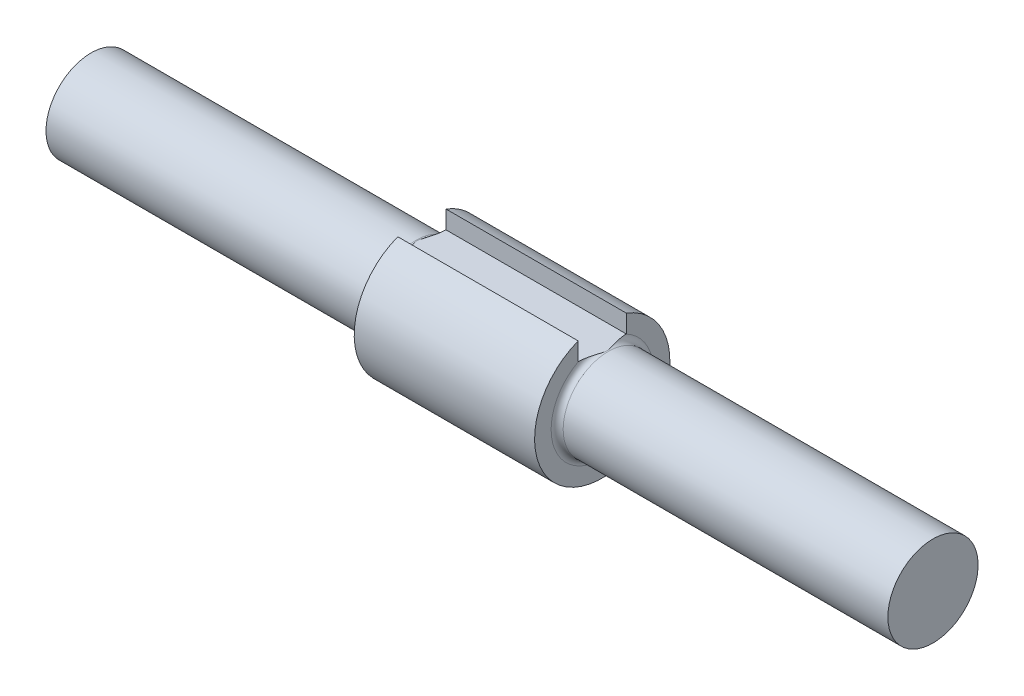
ISO-10303-21;
HEADER;
FILE_DESCRIPTION(('STEP AP214'),'2;1');
FILE_NAME('part.step','',(''),(''),'','','');
FILE_SCHEMA(('AUTOMOTIVE_DESIGN { 1 0 10303 214 1 1 1 1 }'));
ENDSEC;
DATA;
#1=APPLICATION_CONTEXT('core data for automotive mechanical design processes');
#2=APPLICATION_PROTOCOL_DEFINITION('international standard','automotive_design',2000,#1);
#3=PRODUCT_CONTEXT('',#1,'mechanical');
#4=PRODUCT('Part','Part','',(#3));
#5=PRODUCT_RELATED_PRODUCT_CATEGORY('part','',(#4));
#6=PRODUCT_DEFINITION_FORMATION('','',#4);
#7=PRODUCT_DEFINITION_CONTEXT('part definition',#1,'design');
#8=PRODUCT_DEFINITION('design','',#6,#7);
#9=PRODUCT_DEFINITION_SHAPE('','',#8);
#10=(LENGTH_UNIT() NAMED_UNIT(*) SI_UNIT(.MILLI.,.METRE.));
#11=(NAMED_UNIT(*) PLANE_ANGLE_UNIT() SI_UNIT($,.RADIAN.));
#12=(NAMED_UNIT(*) SI_UNIT($,.STERADIAN.) SOLID_ANGLE_UNIT());
#13=UNCERTAINTY_MEASURE_WITH_UNIT(LENGTH_MEASURE(1.E-05),#10,'distance_accuracy_value','');
#14=(GEOMETRIC_REPRESENTATION_CONTEXT(3) GLOBAL_UNCERTAINTY_ASSIGNED_CONTEXT((#13)) GLOBAL_UNIT_ASSIGNED_CONTEXT((#10,
#11,#12)) REPRESENTATION_CONTEXT('',''));
#15=CARTESIAN_POINT('',(0.,0.,0.));
#16=DIRECTION('',(0.,0.,1.));
#17=DIRECTION('',(1.,0.,0.));
#18=AXIS2_PLACEMENT_3D('',#15,#16,#17);
#19=CARTESIAN_POINT('',(16.,0.,0.));
#20=DIRECTION('',(-1.,0.,0.));
#21=DIRECTION('',(0.,0.,1.));
#22=AXIS2_PLACEMENT_3D('',#19,#20,#21);
#23=TOROIDAL_SURFACE('',#22,8.5,1.);
#24=CARTESIAN_POINT('',(16.,0.,0.));
#25=DIRECTION('',(-1.,0.,0.));
#26=DIRECTION('',(0.,0.,1.));
#27=AXIS2_PLACEMENT_3D('',#24,#25,#26);
#28=CIRCLE('',#27,7.5);
#29=CARTESIAN_POINT('',(16.,0.,7.5));
#30=VERTEX_POINT('',#29);
#31=EDGE_CURVE('E45',#30,#30,#28,.F.);
#32=ORIENTED_EDGE('',*,*,#31,.F.);
#33=EDGE_LOOP('',(#32));
#34=FACE_BOUND('',#33,.T.);
#35=CARTESIAN_POINT('',(15.,7.51487042240655,3.97199226263587));
#36=CARTESIAN_POINT('',(15.0000187505589,7.51487042240655,3.88703352085631));
#37=CARTESIAN_POINT('',(15.0023630392669,7.51487042240655,3.80210585867956));
#38=CARTESIAN_POINT('',(15.011135742183,7.51487042240655,3.63251024263131));
#39=CARTESIAN_POINT('',(15.0175616146759,7.51487042240655,3.54784216006022));
#40=CARTESIAN_POINT('',(15.0339098908058,7.51487042240655,3.3790850231573));
#41=CARTESIAN_POINT('',(15.0438228190897,7.51487042240655,3.29499502309886));
#42=CARTESIAN_POINT('',(15.0666981329807,7.51487042240655,3.12722160038694));
#43=CARTESIAN_POINT('',(15.0796610412921,7.51487042240655,3.04353824993677));
#44=CARTESIAN_POINT('',(15.1218302997458,7.51487042240655,2.79714902328586));
#45=CARTESIAN_POINT('',(15.1547498950543,7.51487042240655,2.6350769640333));
#46=CARTESIAN_POINT('',(15.2281368403217,7.51487042240655,2.31258774451004));
#47=CARTESIAN_POINT('',(15.2686093003015,7.51487042240655,2.15217178270574));
#48=CARTESIAN_POINT('',(15.3422899468921,7.51487042240655,1.87943471257915));
#49=CARTESIAN_POINT('',(15.3741681430943,7.51487042240655,1.76674848910801));
#50=CARTESIAN_POINT('',(15.4397974027,7.51487042240655,1.54192313128326));
#51=CARTESIAN_POINT('',(15.473548517696,7.51487042240655,1.42978401209319));
#52=CARTESIAN_POINT('',(15.5423173621176,7.51487042240655,1.204694155472));
#53=CARTESIAN_POINT('',(15.5773442730905,7.51487042240655,1.09174625740689));
#54=CARTESIAN_POINT('',(15.6293581804725,7.51487042240655,0.922166560801882));
#55=CARTESIAN_POINT('',(15.6466077465711,7.51487042240655,0.865615886836521));
#56=CARTESIAN_POINT('',(15.6805476971529,7.51487042240655,0.752347752002099));
#57=CARTESIAN_POINT('',(15.6972381026146,7.51487042240655,0.695630297477327));
#58=CARTESIAN_POINT('',(15.7292061090391,7.51487042240655,0.582697232278781));
#59=CARTESIAN_POINT('',(15.7445009381991,7.51487042240655,0.526486585173341));
#60=CARTESIAN_POINT('',(15.7728828178778,7.51487042240655,0.413444393899795));
#61=CARTESIAN_POINT('',(15.7859680756157,7.51487042240655,0.356612385003505));
#62=CARTESIAN_POINT('',(15.8077873021507,7.51487042240655,0.242909804561486));
#63=CARTESIAN_POINT('',(15.816581748859,7.51487042240655,0.186051798674885));
#64=CARTESIAN_POINT('',(15.8273423669651,7.51487042240655,0.0718132339081105));
#65=CARTESIAN_POINT('',(15.8293330652533,7.51487042240655,0.0144353012410257));
#66=CARTESIAN_POINT('',(15.8257171812296,7.51487042240655,-0.0978298791481195));
#67=CARTESIAN_POINT('',(15.8204005872786,7.51487042240655,-0.15272785469215));
#68=CARTESIAN_POINT('',(15.8046725197431,7.51487042240655,-0.261823380321094));
#69=CARTESIAN_POINT('',(15.7942507215727,7.51487042240655,-0.316019281605397));
#70=CARTESIAN_POINT('',(15.7703926152009,7.51487042240655,-0.424221460912556));
#71=CARTESIAN_POINT('',(15.756930087757,7.51487042240655,-0.478221670115047));
#72=CARTESIAN_POINT('',(15.7284085960532,7.51487042240655,-0.585743568581094));
#73=CARTESIAN_POINT('',(15.7133508839795,7.51487042240655,-0.639265597937844));
#74=CARTESIAN_POINT('',(15.665822416007,7.51487042240655,-0.803476931157981));
#75=CARTESIAN_POINT('',(15.6320316545254,7.51487042240655,-0.913777602019959));
#76=CARTESIAN_POINT('',(15.5643102641447,7.51487042240655,-1.13376370455158));
#77=CARTESIAN_POINT('',(15.530381022138,7.51487042240655,-1.24344960678863));
#78=CARTESIAN_POINT('',(15.4642842883255,7.51487042240655,-1.46053930114408));
#79=CARTESIAN_POINT('',(15.4320941247495,7.51487042240655,-1.5679360084842));
#80=CARTESIAN_POINT('',(15.3694883043932,7.51487042240655,-1.78323916318933));
#81=CARTESIAN_POINT('',(15.3390726257398,7.51487042240655,-1.8911456042534));
#82=CARTESIAN_POINT('',(15.2513808092698,7.51487042240655,-2.21636312315868));
#83=CARTESIAN_POINT('',(15.1978017647467,7.51487042240655,-2.43472778164977));
#84=CARTESIAN_POINT('',(15.1295797977089,7.51487042240655,-2.76244784518246));
#85=CARTESIAN_POINT('',(15.1090197799795,7.51487042240655,-2.87056936639991));
#86=CARTESIAN_POINT('',(15.072416964731,7.51487042240655,-3.08756671579516));
#87=CARTESIAN_POINT('',(15.0563733642104,7.51487042240655,-3.19644240635308));
#88=CARTESIAN_POINT('',(15.0297246661582,7.51487042240655,-3.41467690514383));
#89=CARTESIAN_POINT('',(15.0191097686074,7.51487042240655,-3.5240344807964));
#90=CARTESIAN_POINT('',(15.0043652125565,7.51487042240655,-3.7431660807675));
#91=CARTESIAN_POINT('',(15.0002339927254,7.51487042240655,-3.85293999844233));
#92=CARTESIAN_POINT('',(14.9997315589716,7.51487042240655,-4.09849629509067));
#93=CARTESIAN_POINT('',(15.0054196238268,7.51487042240655,-4.23430847815995));
#94=CARTESIAN_POINT('',(15.025499847861,7.51487042240655,-4.43759393184489));
#95=CARTESIAN_POINT('',(15.0341931435305,7.51487042240655,-4.50563317249623));
#96=CARTESIAN_POINT('',(15.0561070883657,7.51487042240655,-4.64105848337031));
#97=CARTESIAN_POINT('',(15.0693333837213,7.51487042240655,-4.70844363071249));
#98=CARTESIAN_POINT('',(15.0851268071502,7.51487042240655,-4.7752834212117));
#99=B_SPLINE_CURVE_WITH_KNOTS('',3,(#35,#36,#37,#38,#39,#40,#41,#42,#43,#44,#45,#46,#47,#48,#49,
#50,#51,#52,#53,#54,#55,#56,#57,#58,#59,#60,#61,#62,#63,#64,#65,#66,#67,#68,#69,#70,#71,#72,#73,
#74,#75,#76,#77,#78,#79,#80,#81,#82,#83,#84,#85,#86,#87,#88,#89,#90,#91,#92,#93,#94,#95,#96,#97,
#98),.UNSPECIFIED.,.F.,.F.,(4,2,2,2,2,2,2,2,2,2,2,2,2,2,2,2,2,2,2,2,2,2,2,2,2,2,2,2,2,2,2,4),
(0.,0.254800041369204,0.509441567052595,0.763396435016173,1.01739485740921,1.51326524793099,
2.0094723524663,2.36077745366209,2.71209223695072,3.06685582290921,3.24422383642343,
3.42158518800213,3.59632650066852,3.77120891902509,3.94354958000482,4.11526830961506,
4.2803656310432,4.4457982266006,4.61271578432215,4.77950327275994,5.12556443232155,
5.47001193991619,5.80634813915575,6.14268019168296,6.81674371821175,7.14684554040642,
7.47688863465423,7.80633380562715,8.13569963089529,8.54272200563269,8.74836431850698,
8.95426371080245),.UNSPECIFIED.);
#100=CARTESIAN_POINT('',(15.,7.51487042240655,3.97199226263587));
#101=VERTEX_POINT('',#100);
#102=CARTESIAN_POINT('',(15.,7.51487042240655,-3.97199226263587));
#103=VERTEX_POINT('',#102);
#104=EDGE_CURVE('E11',#101,#103,#99,.T.);
#105=ORIENTED_EDGE('',*,*,#104,.F.);
#106=CARTESIAN_POINT('',(15.,0.,0.));
#107=DIRECTION('',(-1.,0.,0.));
#108=DIRECTION('',(0.,0.,1.));
#109=AXIS2_PLACEMENT_3D('',#106,#107,#108);
#110=CIRCLE('',#109,8.5);
#111=EDGE_CURVE('E108',#103,#101,#110,.T.);
#112=ORIENTED_EDGE('',*,*,#111,.F.);
#113=EDGE_LOOP('',(#105,#112));
#114=FACE_BOUND('',#113,.T.);
#115=ADVANCED_FACE('F33',(#34,#114),#23,.F.);
#116=CARTESIAN_POINT('',(-16.,0.,0.));
#117=DIRECTION('',(1.,0.,0.));
#118=DIRECTION('',(0.,0.,-1.));
#119=AXIS2_PLACEMENT_3D('',#116,#117,#118);
#120=TOROIDAL_SURFACE('',#119,8.5,1.);
#121=CARTESIAN_POINT('',(-16.,0.,0.));
#122=DIRECTION('',(1.,0.,0.));
#123=DIRECTION('',(0.,0.,-1.));
#124=AXIS2_PLACEMENT_3D('',#121,#122,#123);
#125=CIRCLE('',#124,7.5);
#126=CARTESIAN_POINT('',(-16.,0.,-7.5));
#127=VERTEX_POINT('',#126);
#128=EDGE_CURVE('E135',#127,#127,#125,.F.);
#129=ORIENTED_EDGE('',*,*,#128,.F.);
#130=EDGE_LOOP('',(#129));
#131=FACE_BOUND('',#130,.T.);
#132=CARTESIAN_POINT('',(-15.,7.51487042240655,-3.97199226263588));
#133=CARTESIAN_POINT('',(-15.0000187505589,7.51487042240655,-3.88703352085633));
#134=CARTESIAN_POINT('',(-15.0023630392669,7.51487042240655,-3.80210585867958));
#135=CARTESIAN_POINT('',(-15.011135742183,7.51487042240655,-3.63251024263133));
#136=CARTESIAN_POINT('',(-15.0175616146759,7.51487042240655,-3.54784216006024));
#137=CARTESIAN_POINT('',(-15.0339098908058,7.51487042240655,-3.37908502315732));
#138=CARTESIAN_POINT('',(-15.0438228190897,7.51487042240655,-3.29499502309888));
#139=CARTESIAN_POINT('',(-15.0666981329807,7.51487042240655,-3.12722160038696));
#140=CARTESIAN_POINT('',(-15.0796610412921,7.51487042240655,-3.0435382499368));
#141=CARTESIAN_POINT('',(-15.1218302997458,7.51487042240655,-2.79714902328589));
#142=CARTESIAN_POINT('',(-15.1547498950543,7.51487042240655,-2.63507696403333));
#143=CARTESIAN_POINT('',(-15.2281368403217,7.51487042240655,-2.31258774451007));
#144=CARTESIAN_POINT('',(-15.2686093003015,7.51487042240655,-2.15217178270577));
#145=CARTESIAN_POINT('',(-15.3422899468921,7.51487042240655,-1.87943471257918));
#146=CARTESIAN_POINT('',(-15.3741681430943,7.51487042240655,-1.76674848910805));
#147=CARTESIAN_POINT('',(-15.4397974027,7.51487042240655,-1.5419231312833));
#148=CARTESIAN_POINT('',(-15.473548517696,7.51487042240655,-1.42978401209324));
#149=CARTESIAN_POINT('',(-15.5423173621176,7.51487042240655,-1.20469415547205));
#150=CARTESIAN_POINT('',(-15.5773442730905,7.51487042240655,-1.09174625740695));
#151=CARTESIAN_POINT('',(-15.6293581804725,7.51487042240655,-0.922166560801942));
#152=CARTESIAN_POINT('',(-15.6466077465711,7.51487042240655,-0.865615886836582));
#153=CARTESIAN_POINT('',(-15.6805476971529,7.51487042240655,-0.752347752002163));
#154=CARTESIAN_POINT('',(-15.6972381026146,7.51487042240655,-0.695630297477392));
#155=CARTESIAN_POINT('',(-15.7292061090391,7.51487042240655,-0.582697232278841));
#156=CARTESIAN_POINT('',(-15.7445009381991,7.51487042240655,-0.526486585173395));
#157=CARTESIAN_POINT('',(-15.7728828178778,7.51487042240655,-0.413444393899838));
#158=CARTESIAN_POINT('',(-15.7859680756157,7.51487042240655,-0.356612385003541));
#159=CARTESIAN_POINT('',(-15.8077873021507,7.51487042240655,-0.24290980456151));
#160=CARTESIAN_POINT('',(-15.816581748859,7.51487042240655,-0.186051798674904));
#161=CARTESIAN_POINT('',(-15.8273423669651,7.51487042240655,-0.0718132339081161));
#162=CARTESIAN_POINT('',(-15.8293330652533,7.51487042240655,-0.0144353012410245));
#163=CARTESIAN_POINT('',(-15.8257171812297,7.51487042240655,0.097829879148136));
#164=CARTESIAN_POINT('',(-15.8204005872787,7.51487042240655,0.152727854692175));
#165=CARTESIAN_POINT('',(-15.8046725197431,7.51487042240655,0.261823380321136));
#166=CARTESIAN_POINT('',(-15.7942507215728,7.51487042240655,0.316019281605447));
#167=CARTESIAN_POINT('',(-15.7703926152009,7.51487042240655,0.424221460912623));
#168=CARTESIAN_POINT('',(-15.756930087757,7.51487042240655,0.478221670115123));
#169=CARTESIAN_POINT('',(-15.7284085960532,7.51487042240655,0.585743568581186));
#170=CARTESIAN_POINT('',(-15.7133508839795,7.51487042240655,0.639265597937945));
#171=CARTESIAN_POINT('',(-15.665822416007,7.51487042240655,0.803476931158111));
#172=CARTESIAN_POINT('',(-15.6320316545254,7.51487042240655,0.913777602020109));
#173=CARTESIAN_POINT('',(-15.5643102641447,7.51487042240655,1.13376370455177));
#174=CARTESIAN_POINT('',(-15.530381022138,7.51487042240655,1.24344960678884));
#175=CARTESIAN_POINT('',(-15.4642842883255,7.51487042240655,1.46053930114433));
#176=CARTESIAN_POINT('',(-15.4320941247494,7.51487042240655,1.56793600848447));
#177=CARTESIAN_POINT('',(-15.3694883043931,7.51487042240655,1.78323916318965));
#178=CARTESIAN_POINT('',(-15.3390726257398,7.51487042240655,1.89114560425374));
#179=CARTESIAN_POINT('',(-15.2513808092697,7.51487042240655,2.21636312315908));
#180=CARTESIAN_POINT('',(-15.1978017647466,7.51487042240655,2.43472778165022));
#181=CARTESIAN_POINT('',(-15.1295797977088,7.51487042240655,2.76244784518297));
#182=CARTESIAN_POINT('',(-15.1090197799794,7.51487042240655,2.87056936640044));
#183=CARTESIAN_POINT('',(-15.0724169647309,7.51487042240655,3.08756671579573));
#184=CARTESIAN_POINT('',(-15.0563733642104,7.51487042240655,3.19644240635367));
#185=CARTESIAN_POINT('',(-15.0297246661581,7.51487042240655,3.41467690514446));
#186=CARTESIAN_POINT('',(-15.0191097686073,7.51487042240655,3.52403448079706));
#187=CARTESIAN_POINT('',(-15.0043652125565,7.51487042240655,3.74316608076819));
#188=CARTESIAN_POINT('',(-15.0002339927254,7.51487042240655,3.85293999844304));
#189=CARTESIAN_POINT('',(-14.9997315589716,7.51487042240655,4.09849629509136));
#190=CARTESIAN_POINT('',(-15.0054196238268,7.51487042240655,4.2343084781606));
#191=CARTESIAN_POINT('',(-15.025499847861,7.51487042240655,4.43759393184547));
#192=CARTESIAN_POINT('',(-15.0341931435305,7.51487042240655,4.50563317249678));
#193=CARTESIAN_POINT('',(-15.0561070883658,7.51487042240655,4.64105848337082));
#194=CARTESIAN_POINT('',(-15.0693333837214,7.51487042240655,4.70844363071298));
#195=CARTESIAN_POINT('',(-15.0851268071503,7.51487042240655,4.77528342121215));
#196=B_SPLINE_CURVE_WITH_KNOTS('',3,(#132,#133,#134,#135,#136,#137,#138,#139,#140,#141,#142,
#143,#144,#145,#146,#147,#148,#149,#150,#151,#152,#153,#154,#155,#156,#157,#158,#159,#160,#161,
#162,#163,#164,#165,#166,#167,#168,#169,#170,#171,#172,#173,#174,#175,#176,#177,#178,#179,#180,
#181,#182,#183,#184,#185,#186,#187,#188,#189,#190,#191,#192,#193,#194,#195),.UNSPECIFIED.,.F.,
.F.,(4,2,2,2,2,2,2,2,2,2,2,2,2,2,2,2,2,2,2,2,2,2,2,2,2,2,2,2,2,2,2,4),(0.,0.254800041369202,
0.509441567052591,0.763396435016167,1.0173948574092,1.51326524793097,2.00947235246629,
2.36077745366206,2.71209223695069,3.06685582290917,3.24422383642338,3.42158518800209,
3.59632650066849,3.77120891902508,3.94354958000483,4.1152683096151,4.28036563104326,
4.44579822660068,4.61271578432226,4.77950327276008,5.12556443232176,5.47001193991647,
5.80634813915609,6.14268019168336,6.81674371821228,7.14684554040701,7.47688863465488,
7.80633380562786,8.13569963089606,8.54272200563333,8.74836431850755,8.95426371080295),.UNSPECIFIED.);
#197=CARTESIAN_POINT('',(-15.,7.51487042240655,-3.97199226263588));
#198=VERTEX_POINT('',#197);
#199=CARTESIAN_POINT('',(-15.,7.51487042240655,3.97199226263588));
#200=VERTEX_POINT('',#199);
#201=EDGE_CURVE('E138',#198,#200,#196,.T.);
#202=ORIENTED_EDGE('',*,*,#201,.F.);
#203=CARTESIAN_POINT('',(-15.,0.,0.));
#204=DIRECTION('',(1.,0.,0.));
#205=DIRECTION('',(0.,0.,-1.));
#206=AXIS2_PLACEMENT_3D('',#203,#204,#205);
#207=CIRCLE('',#206,8.5);
#208=EDGE_CURVE('E132',#200,#198,#207,.T.);
#209=ORIENTED_EDGE('',*,*,#208,.F.);
#210=EDGE_LOOP('',(#202,#209));
#211=FACE_BOUND('',#210,.T.);
#212=ADVANCED_FACE('F143',(#131,#211),#120,.F.);
#213=CARTESIAN_POINT('',(15.,7.49999999999999,0.));
#214=DIRECTION('',(-1.,0.,0.));
#215=DIRECTION('',(0.,0.,1.));
#216=AXIS2_PLACEMENT_3D('',#213,#214,#215);
#217=PLANE('',#216);
#218=DIRECTION('',(0.,0.,-1.));
#219=VECTOR('',#218,1.);
#220=CARTESIAN_POINT('',(15.,7.51487042240655,0.));
#221=LINE('',#220,#219);
#222=CARTESIAN_POINT('',(15.,7.51487042240655,-4.));
#223=VERTEX_POINT('',#222);
#224=EDGE_CURVE('E97',#103,#223,#221,.T.);
#225=ORIENTED_EDGE('',*,*,#224,.F.);
#226=ORIENTED_EDGE('',*,*,#111,.T.);
#227=CARTESIAN_POINT('',(15.,7.51487042240655,4.));
#228=VERTEX_POINT('',#227);
#229=EDGE_CURVE('E101',#228,#101,#221,.T.);
#230=ORIENTED_EDGE('',*,*,#229,.F.);
#231=DIRECTION('',(0.,-1.,0.));
#232=VECTOR('',#231,1.);
#233=CARTESIAN_POINT('',(15.,7.49999999999999,4.));
#234=LINE('',#233,#232);
#235=CARTESIAN_POINT('',(15.,10.5148704224065,4.));
#236=VERTEX_POINT('',#235);
#237=EDGE_CURVE('E86',#236,#228,#234,.T.);
#238=ORIENTED_EDGE('',*,*,#237,.F.);
#239=CARTESIAN_POINT('',(15.,0.,0.));
#240=DIRECTION('',(-1.,0.,0.));
#241=DIRECTION('',(0.,0.,1.));
#242=AXIS2_PLACEMENT_3D('',#239,#240,#241);
#243=CIRCLE('',#242,11.25);
#244=CARTESIAN_POINT('',(15.,10.5148704224065,-4.));
#245=VERTEX_POINT('',#244);
#246=EDGE_CURVE('E120',#245,#236,#243,.T.);
#247=ORIENTED_EDGE('',*,*,#246,.F.);
#248=DIRECTION('',(0.,1.,0.));
#249=VECTOR('',#248,1.);
#250=CARTESIAN_POINT('',(15.,7.49999999999999,-4.));
#251=LINE('',#250,#249);
#252=EDGE_CURVE('E109',#223,#245,#251,.T.);
#253=ORIENTED_EDGE('',*,*,#252,.F.);
#254=EDGE_LOOP('',(#225,#226,#230,#238,#247,#253));
#255=FACE_BOUND('',#254,.T.);
#256=ADVANCED_FACE('F107',(#255),#217,.F.);
#257=CARTESIAN_POINT('',(0.,0.,0.));
#258=DIRECTION('',(-1.,0.,0.));
#259=DIRECTION('',(0.,0.,1.));
#260=AXIS2_PLACEMENT_3D('',#257,#258,#259);
#261=CYLINDRICAL_SURFACE('',#260,11.25);
#262=DIRECTION('',(1.,0.,0.));
#263=VECTOR('',#262,1.);
#264=CARTESIAN_POINT('',(-70.,10.5148704224065,-4.));
#265=LINE('',#264,#263);
#266=CARTESIAN_POINT('',(-15.,10.5148704224065,-4.));
#267=VERTEX_POINT('',#266);
#268=EDGE_CURVE('E98',#267,#245,#265,.T.);
#269=ORIENTED_EDGE('',*,*,#268,.T.);
#270=ORIENTED_EDGE('',*,*,#246,.T.);
#271=DIRECTION('',(1.,0.,0.));
#272=VECTOR('',#271,1.);
#273=CARTESIAN_POINT('',(-70.,10.5148704224065,4.));
#274=LINE('',#273,#272);
#275=CARTESIAN_POINT('',(-15.,10.5148704224065,4.));
#276=VERTEX_POINT('',#275);
#277=EDGE_CURVE('E92',#276,#236,#274,.T.);
#278=ORIENTED_EDGE('',*,*,#277,.F.);
#279=CARTESIAN_POINT('',(-15.,0.,0.));
#280=DIRECTION('',(-1.,0.,0.));
#281=DIRECTION('',(0.,0.,1.));
#282=AXIS2_PLACEMENT_3D('',#279,#280,#281);
#283=CIRCLE('',#282,11.25);
#284=EDGE_CURVE('E117',#267,#276,#283,.T.);
#285=ORIENTED_EDGE('',*,*,#284,.F.);
#286=EDGE_LOOP('',(#269,#270,#278,#285));
#287=FACE_BOUND('',#286,.T.);
#288=ADVANCED_FACE('F163',(#287),#261,.T.);
#289=CARTESIAN_POINT('',(-15.,11.25,0.));
#290=DIRECTION('',(1.,0.,0.));
#291=DIRECTION('',(0.,0.,-1.));
#292=AXIS2_PLACEMENT_3D('',#289,#290,#291);
#293=PLANE('',#292);
#294=DIRECTION('',(0.,0.,1.));
#295=VECTOR('',#294,1.);
#296=CARTESIAN_POINT('',(-15.,7.51487042240655,0.));
#297=LINE('',#296,#295);
#298=CARTESIAN_POINT('',(-15.,7.51487042240655,4.));
#299=VERTEX_POINT('',#298);
#300=EDGE_CURVE('E103',#200,#299,#297,.T.);
#301=ORIENTED_EDGE('',*,*,#300,.F.);
#302=ORIENTED_EDGE('',*,*,#208,.T.);
#303=CARTESIAN_POINT('',(-15.,7.51487042240655,-4.));
#304=VERTEX_POINT('',#303);
#305=EDGE_CURVE('E127',#304,#198,#297,.T.);
#306=ORIENTED_EDGE('',*,*,#305,.F.);
#307=DIRECTION('',(0.,-1.,0.));
#308=VECTOR('',#307,1.);
#309=CARTESIAN_POINT('',(-15.,11.25,-4.));
#310=LINE('',#309,#308);
#311=EDGE_CURVE('E130',#267,#304,#310,.T.);
#312=ORIENTED_EDGE('',*,*,#311,.F.);
#313=ORIENTED_EDGE('',*,*,#284,.T.);
#314=DIRECTION('',(0.,1.,0.));
#315=VECTOR('',#314,1.);
#316=CARTESIAN_POINT('',(-15.,11.25,4.));
#317=LINE('',#316,#315);
#318=EDGE_CURVE('E125',#299,#276,#317,.T.);
#319=ORIENTED_EDGE('',*,*,#318,.F.);
#320=EDGE_LOOP('',(#301,#302,#306,#312,#313,#319));
#321=FACE_BOUND('',#320,.T.);
#322=ADVANCED_FACE('F159',(#321),#293,.F.);
#323=CARTESIAN_POINT('',(-70.,7.5,0.));
#324=DIRECTION('',(1.,0.,0.));
#325=DIRECTION('',(0.,0.,-1.));
#326=AXIS2_PLACEMENT_3D('',#323,#324,#325);
#327=PLANE('',#326);
#328=CARTESIAN_POINT('',(-70.,0.,0.));
#329=DIRECTION('',(-1.,0.,0.));
#330=DIRECTION('',(0.,0.,1.));
#331=AXIS2_PLACEMENT_3D('',#328,#329,#330);
#332=CIRCLE('',#331,7.5);
#333=CARTESIAN_POINT('',(-70.,0.,7.5));
#334=VERTEX_POINT('',#333);
#335=EDGE_CURVE('E111',#334,#334,#332,.T.);
#336=ORIENTED_EDGE('',*,*,#335,.T.);
#337=EDGE_LOOP('',(#336));
#338=FACE_BOUND('',#337,.T.);
#339=ADVANCED_FACE('F162',(#338),#327,.F.);
#340=CARTESIAN_POINT('',(70.,0.,0.));
#341=DIRECTION('',(-1.,0.,0.));
#342=DIRECTION('',(0.,0.,1.));
#343=AXIS2_PLACEMENT_3D('',#340,#341,#342);
#344=PLANE('',#343);
#345=CARTESIAN_POINT('',(70.,0.,0.));
#346=DIRECTION('',(-1.,0.,0.));
#347=DIRECTION('',(0.,0.,1.));
#348=AXIS2_PLACEMENT_3D('',#345,#346,#347);
#349=CIRCLE('',#348,7.5);
#350=CARTESIAN_POINT('',(70.,0.,7.5));
#351=VERTEX_POINT('',#350);
#352=EDGE_CURVE('E122',#351,#351,#349,.T.);
#353=ORIENTED_EDGE('',*,*,#352,.F.);
#354=EDGE_LOOP('',(#353));
#355=FACE_BOUND('',#354,.T.);
#356=ADVANCED_FACE('F172',(#355),#344,.F.);
#357=CARTESIAN_POINT('',(0.,0.,0.));
#358=DIRECTION('',(-1.,0.,0.));
#359=DIRECTION('',(0.,0.,1.));
#360=AXIS2_PLACEMENT_3D('',#357,#358,#359);
#361=CYLINDRICAL_SURFACE('',#360,7.5);
#362=ORIENTED_EDGE('',*,*,#31,.T.);
#363=EDGE_LOOP('',(#362));
#364=FACE_BOUND('',#363,.T.);
#365=ORIENTED_EDGE('',*,*,#352,.T.);
#366=EDGE_LOOP('',(#365));
#367=FACE_BOUND('',#366,.T.);
#368=ADVANCED_FACE('F157',(#364,#367),#361,.T.);
#369=CARTESIAN_POINT('',(0.,0.,0.));
#370=DIRECTION('',(-1.,0.,0.));
#371=DIRECTION('',(0.,0.,1.));
#372=AXIS2_PLACEMENT_3D('',#369,#370,#371);
#373=CYLINDRICAL_SURFACE('',#372,7.5);
#374=ORIENTED_EDGE('',*,*,#128,.T.);
#375=EDGE_LOOP('',(#374));
#376=FACE_BOUND('',#375,.T.);
#377=ORIENTED_EDGE('',*,*,#335,.F.);
#378=EDGE_LOOP('',(#377));
#379=FACE_BOUND('',#378,.T.);
#380=ADVANCED_FACE('F154',(#376,#379),#373,.T.);
#381=CARTESIAN_POINT('',(-70.,0.,-4.));
#382=DIRECTION('',(0.,0.,1.));
#383=DIRECTION('',(1.,0.,0.));
#384=AXIS2_PLACEMENT_3D('',#381,#382,#383);
#385=PLANE('',#384);
#386=ORIENTED_EDGE('',*,*,#252,.T.);
#387=ORIENTED_EDGE('',*,*,#268,.F.);
#388=ORIENTED_EDGE('',*,*,#311,.T.);
#389=DIRECTION('',(1.,0.,0.));
#390=VECTOR('',#389,1.);
#391=CARTESIAN_POINT('',(-70.,7.51487042240655,-4.));
#392=LINE('',#391,#390);
#393=EDGE_CURVE('E104',#304,#223,#392,.T.);
#394=ORIENTED_EDGE('',*,*,#393,.T.);
#395=EDGE_LOOP('',(#386,#387,#388,#394));
#396=FACE_BOUND('',#395,.T.);
#397=ADVANCED_FACE('F150',(#396),#385,.T.);
#398=CARTESIAN_POINT('',(-70.,7.51487042240655,0.));
#399=DIRECTION('',(0.,1.,0.));
#400=DIRECTION('',(0.,0.,1.));
#401=AXIS2_PLACEMENT_3D('',#398,#399,#400);
#402=PLANE('',#401);
#403=ORIENTED_EDGE('',*,*,#229,.T.);
#404=ORIENTED_EDGE('',*,*,#104,.T.);
#405=ORIENTED_EDGE('',*,*,#224,.T.);
#406=ORIENTED_EDGE('',*,*,#393,.F.);
#407=ORIENTED_EDGE('',*,*,#305,.T.);
#408=ORIENTED_EDGE('',*,*,#201,.T.);
#409=ORIENTED_EDGE('',*,*,#300,.T.);
#410=DIRECTION('',(1.,0.,0.));
#411=VECTOR('',#410,1.);
#412=CARTESIAN_POINT('',(-70.,7.51487042240655,4.));
#413=LINE('',#412,#411);
#414=EDGE_CURVE('E89',#299,#228,#413,.T.);
#415=ORIENTED_EDGE('',*,*,#414,.T.);
#416=EDGE_LOOP('',(#403,#404,#405,#406,#407,#408,#409,#415));
#417=FACE_BOUND('',#416,.T.);
#418=ADVANCED_FACE('F100',(#417),#402,.T.);
#419=CARTESIAN_POINT('',(-70.,0.,4.));
#420=DIRECTION('',(0.,0.,-1.));
#421=DIRECTION('',(-1.,0.,0.));
#422=AXIS2_PLACEMENT_3D('',#419,#420,#421);
#423=PLANE('',#422);
#424=ORIENTED_EDGE('',*,*,#237,.T.);
#425=ORIENTED_EDGE('',*,*,#414,.F.);
#426=ORIENTED_EDGE('',*,*,#318,.T.);
#427=ORIENTED_EDGE('',*,*,#277,.T.);
#428=EDGE_LOOP('',(#424,#425,#426,#427));
#429=FACE_BOUND('',#428,.T.);
#430=ADVANCED_FACE('F88',(#429),#423,.T.);
#431=CLOSED_SHELL('',(#115,#212,#256,#288,#322,#339,#356,#368,#380,#397,#418,#430));
#432=MANIFOLD_SOLID_BREP('B2',#431);
#433=ADVANCED_BREP_SHAPE_REPRESENTATION('',(#18,#432),#14);
#434=SHAPE_DEFINITION_REPRESENTATION(#9,#433);
ENDSEC;
END-ISO-10303-21;
